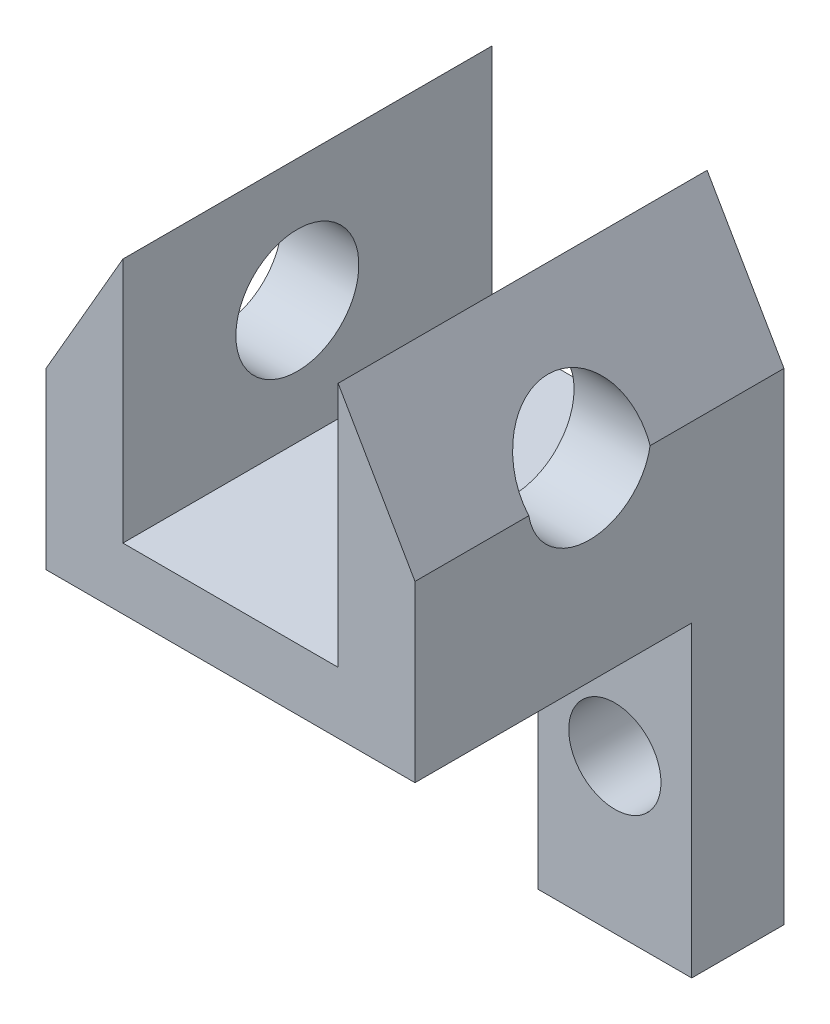
ISO-10303-21;
HEADER;
FILE_DESCRIPTION(('STEP AP214'),'2;1');
FILE_NAME('part.step','',(''),(''),'','','');
FILE_SCHEMA(('AUTOMOTIVE_DESIGN { 1 0 10303 214 1 1 1 1 }'));
ENDSEC;
DATA;
#1=APPLICATION_CONTEXT('core data for automotive mechanical design processes');
#2=APPLICATION_PROTOCOL_DEFINITION('international standard','automotive_design',2000,#1);
#3=PRODUCT_CONTEXT('',#1,'mechanical');
#4=PRODUCT('Part','Part','',(#3));
#5=PRODUCT_RELATED_PRODUCT_CATEGORY('part','',(#4));
#6=PRODUCT_DEFINITION_FORMATION('','',#4);
#7=PRODUCT_DEFINITION_CONTEXT('part definition',#1,'design');
#8=PRODUCT_DEFINITION('design','',#6,#7);
#9=PRODUCT_DEFINITION_SHAPE('','',#8);
#10=(LENGTH_UNIT() NAMED_UNIT(*) SI_UNIT(.MILLI.,.METRE.));
#11=(NAMED_UNIT(*) PLANE_ANGLE_UNIT() SI_UNIT($,.RADIAN.));
#12=(NAMED_UNIT(*) SI_UNIT($,.STERADIAN.) SOLID_ANGLE_UNIT());
#13=UNCERTAINTY_MEASURE_WITH_UNIT(LENGTH_MEASURE(1.E-05),#10,'distance_accuracy_value','');
#14=(GEOMETRIC_REPRESENTATION_CONTEXT(3) GLOBAL_UNCERTAINTY_ASSIGNED_CONTEXT((#13)) GLOBAL_UNIT_ASSIGNED_CONTEXT((#10,
#11,#12)) REPRESENTATION_CONTEXT('',''));
#15=CARTESIAN_POINT('',(0.,0.,0.));
#16=DIRECTION('',(0.,0.,1.));
#17=DIRECTION('',(1.,0.,0.));
#18=AXIS2_PLACEMENT_3D('',#15,#16,#17);
#19=CARTESIAN_POINT('',(-6.,2.,6.));
#20=DIRECTION('',(1.,0.,0.));
#21=DIRECTION('',(0.,0.,-1.));
#22=AXIS2_PLACEMENT_3D('',#19,#20,#21);
#23=PLANE('',#22);
#24=CARTESIAN_POINT('',(-6.,6.,0.326138493477825));
#25=DIRECTION('',(-1.,0.,0.));
#26=DIRECTION('',(0.,0.,1.));
#27=AXIS2_PLACEMENT_3D('',#24,#25,#26);
#28=CIRCLE('',#27,2.);
#29=CARTESIAN_POINT('',(-6.,5.66987298107782,-1.64642738663304));
#30=VERTEX_POINT('',#29);
#31=CARTESIAN_POINT('',(-6.,5.66987298107782,2.29870437358869));
#32=VERTEX_POINT('',#31);
#33=EDGE_CURVE('E162',#30,#32,#28,.T.);
#34=ORIENTED_EDGE('',*,*,#33,.F.);
#35=DIRECTION('',(0.,0.,1.));
#36=VECTOR('',#35,1.);
#37=CARTESIAN_POINT('',(-6.,5.66987298107782,-6.));
#38=LINE('',#37,#36);
#39=CARTESIAN_POINT('',(-6.,5.66987298107782,-6.));
#40=VERTEX_POINT('',#39);
#41=EDGE_CURVE('E187',#40,#30,#38,.T.);
#42=ORIENTED_EDGE('',*,*,#41,.F.);
#43=DIRECTION('',(0.,-1.,0.));
#44=VECTOR('',#43,1.);
#45=CARTESIAN_POINT('',(-6.,2.,-6.));
#46=LINE('',#45,#44);
#47=CARTESIAN_POINT('',(-6.,0.,-6.));
#48=VERTEX_POINT('',#47);
#49=EDGE_CURVE('E236',#40,#48,#46,.T.);
#50=ORIENTED_EDGE('',*,*,#49,.T.);
#51=DIRECTION('',(0.,0.,1.));
#52=VECTOR('',#51,1.);
#53=CARTESIAN_POINT('',(-6.,0.,6.));
#54=LINE('',#53,#52);
#55=CARTESIAN_POINT('',(-6.,0.,6.));
#56=VERTEX_POINT('',#55);
#57=EDGE_CURVE('E227',#48,#56,#54,.T.);
#58=ORIENTED_EDGE('',*,*,#57,.T.);
#59=DIRECTION('',(0.,-1.,0.));
#60=VECTOR('',#59,1.);
#61=CARTESIAN_POINT('',(-6.,2.,6.));
#62=LINE('',#61,#60);
#63=CARTESIAN_POINT('',(-6.,5.66987298107781,6.));
#64=VERTEX_POINT('',#63);
#65=EDGE_CURVE('E237',#64,#56,#62,.T.);
#66=ORIENTED_EDGE('',*,*,#65,.F.);
#67=EDGE_CURVE('E189',#32,#64,#38,.T.);
#68=ORIENTED_EDGE('',*,*,#67,.F.);
#69=EDGE_LOOP('',(#34,#42,#50,#58,#66,#68));
#70=FACE_BOUND('',#69,.T.);
#71=ADVANCED_FACE('F44',(#70),#23,.F.);
#72=CARTESIAN_POINT('',(-6.,2.,6.));
#73=DIRECTION('',(0.,0.,-1.));
#74=DIRECTION('',(-1.,0.,0.));
#75=AXIS2_PLACEMENT_3D('',#72,#73,#74);
#76=PLANE('',#75);
#77=DIRECTION('',(0.500000000000001,0.866025403784438,0.));
#78=VECTOR('',#77,1.);
#79=CARTESIAN_POINT('',(-3.5,10.,6.));
#80=LINE('',#79,#78);
#81=CARTESIAN_POINT('',(-3.5,10.,6.));
#82=VERTEX_POINT('',#81);
#83=EDGE_CURVE('E186',#64,#82,#80,.T.);
#84=ORIENTED_EDGE('',*,*,#83,.F.);
#85=ORIENTED_EDGE('',*,*,#65,.T.);
#86=DIRECTION('',(1.,0.,0.));
#87=VECTOR('',#86,1.);
#88=CARTESIAN_POINT('',(-6.,0.,6.));
#89=LINE('',#88,#87);
#90=CARTESIAN_POINT('',(6.,0.,6.));
#91=VERTEX_POINT('',#90);
#92=EDGE_CURVE('E223',#56,#91,#89,.T.);
#93=ORIENTED_EDGE('',*,*,#92,.T.);
#94=DIRECTION('',(0.,-1.,0.));
#95=VECTOR('',#94,1.);
#96=CARTESIAN_POINT('',(6.,2.,6.));
#97=LINE('',#96,#95);
#98=CARTESIAN_POINT('',(6.,5.66987298107782,6.));
#99=VERTEX_POINT('',#98);
#100=EDGE_CURVE('E226',#99,#91,#97,.T.);
#101=ORIENTED_EDGE('',*,*,#100,.F.);
#102=DIRECTION('',(0.500000000000001,-0.866025403784438,0.));
#103=VECTOR('',#102,1.);
#104=CARTESIAN_POINT('',(3.5,10.,6.));
#105=LINE('',#104,#103);
#106=CARTESIAN_POINT('',(3.5,10.,6.));
#107=VERTEX_POINT('',#106);
#108=EDGE_CURVE('E188',#107,#99,#105,.T.);
#109=ORIENTED_EDGE('',*,*,#108,.F.);
#110=DIRECTION('',(0.,-1.,0.));
#111=VECTOR('',#110,1.);
#112=CARTESIAN_POINT('',(3.5,10.,6.));
#113=LINE('',#112,#111);
#114=CARTESIAN_POINT('',(3.5,2.,6.));
#115=VERTEX_POINT('',#114);
#116=EDGE_CURVE('E214',#107,#115,#113,.T.);
#117=ORIENTED_EDGE('',*,*,#116,.T.);
#118=DIRECTION('',(1.,0.,0.));
#119=VECTOR('',#118,1.);
#120=CARTESIAN_POINT('',(-6.,2.,6.));
#121=LINE('',#120,#119);
#122=CARTESIAN_POINT('',(-3.5,2.,6.));
#123=VERTEX_POINT('',#122);
#124=EDGE_CURVE('E221',#123,#115,#121,.T.);
#125=ORIENTED_EDGE('',*,*,#124,.F.);
#126=DIRECTION('',(0.,-1.,0.));
#127=VECTOR('',#126,1.);
#128=CARTESIAN_POINT('',(-3.5,10.,6.));
#129=LINE('',#128,#127);
#130=EDGE_CURVE('E209',#82,#123,#129,.T.);
#131=ORIENTED_EDGE('',*,*,#130,.F.);
#132=EDGE_LOOP('',(#84,#85,#93,#101,#109,#117,#125,#131));
#133=FACE_BOUND('',#132,.T.);
#134=ADVANCED_FACE('F269',(#133),#76,.F.);
#135=CARTESIAN_POINT('',(0.,2.,0.));
#136=DIRECTION('',(0.,-1.,0.));
#137=DIRECTION('',(0.,0.,-1.));
#138=AXIS2_PLACEMENT_3D('',#135,#136,#137);
#139=PLANE('',#138);
#140=DIRECTION('',(0.,0.,-1.));
#141=VECTOR('',#140,1.);
#142=CARTESIAN_POINT('',(-3.5,2.,-6.));
#143=LINE('',#142,#141);
#144=CARTESIAN_POINT('',(-3.5,2.,-6.));
#145=VERTEX_POINT('',#144);
#146=EDGE_CURVE('E204',#123,#145,#143,.T.);
#147=ORIENTED_EDGE('',*,*,#146,.F.);
#148=ORIENTED_EDGE('',*,*,#124,.T.);
#149=DIRECTION('',(0.,0.,1.));
#150=VECTOR('',#149,1.);
#151=CARTESIAN_POINT('',(3.5,2.,6.));
#152=LINE('',#151,#150);
#153=CARTESIAN_POINT('',(3.5,2.,-6.));
#154=VERTEX_POINT('',#153);
#155=EDGE_CURVE('E210',#154,#115,#152,.T.);
#156=ORIENTED_EDGE('',*,*,#155,.F.);
#157=DIRECTION('',(-1.,0.,0.));
#158=VECTOR('',#157,1.);
#159=CARTESIAN_POINT('',(-6.,2.,-6.));
#160=LINE('',#159,#158);
#161=EDGE_CURVE('E225',#154,#145,#160,.T.);
#162=ORIENTED_EDGE('',*,*,#161,.T.);
#163=EDGE_LOOP('',(#147,#148,#156,#162));
#164=FACE_BOUND('',#163,.T.);
#165=ADVANCED_FACE('F292',(#164),#139,.F.);
#166=CARTESIAN_POINT('',(6.,2.,6.));
#167=DIRECTION('',(-1.,0.,0.));
#168=DIRECTION('',(0.,0.,1.));
#169=AXIS2_PLACEMENT_3D('',#166,#167,#168);
#170=PLANE('',#169);
#171=DIRECTION('',(0.,0.,1.));
#172=VECTOR('',#171,1.);
#173=CARTESIAN_POINT('',(6.,5.66987298107782,-6.));
#174=LINE('',#173,#172);
#175=CARTESIAN_POINT('',(6.,5.66987298107782,-6.));
#176=VERTEX_POINT('',#175);
#177=CARTESIAN_POINT('',(6.,5.66987298107782,-1.64642738663304));
#178=VERTEX_POINT('',#177);
#179=EDGE_CURVE('E193',#176,#178,#174,.T.);
#180=ORIENTED_EDGE('',*,*,#179,.T.);
#181=CARTESIAN_POINT('',(6.,6.,0.326138493477825));
#182=DIRECTION('',(-1.,0.,0.));
#183=DIRECTION('',(0.,0.,1.));
#184=AXIS2_PLACEMENT_3D('',#181,#182,#183);
#185=CIRCLE('',#184,2.);
#186=CARTESIAN_POINT('',(6.,5.66987298107782,2.29870437358869));
#187=VERTEX_POINT('',#186);
#188=EDGE_CURVE('E164',#178,#187,#185,.T.);
#189=ORIENTED_EDGE('',*,*,#188,.T.);
#190=EDGE_CURVE('E185',#187,#99,#174,.T.);
#191=ORIENTED_EDGE('',*,*,#190,.T.);
#192=ORIENTED_EDGE('',*,*,#100,.T.);
#193=DIRECTION('',(0.,0.,-1.));
#194=VECTOR('',#193,1.);
#195=CARTESIAN_POINT('',(6.,0.,6.));
#196=LINE('',#195,#194);
#197=CARTESIAN_POINT('',(6.,0.,-3.));
#198=VERTEX_POINT('',#197);
#199=EDGE_CURVE('E165',#91,#198,#196,.T.);
#200=ORIENTED_EDGE('',*,*,#199,.T.);
#201=DIRECTION('',(0.,1.,0.));
#202=VECTOR('',#201,1.);
#203=CARTESIAN_POINT('',(6.,-10.,-3.));
#204=LINE('',#203,#202);
#205=CARTESIAN_POINT('',(6.,-10.,-3.));
#206=VERTEX_POINT('',#205);
#207=EDGE_CURVE('E145',#206,#198,#204,.T.);
#208=ORIENTED_EDGE('',*,*,#207,.F.);
#209=DIRECTION('',(0.,0.,1.));
#210=VECTOR('',#209,1.);
#211=CARTESIAN_POINT('',(6.,-10.,-6.));
#212=LINE('',#211,#210);
#213=CARTESIAN_POINT('',(6.,-10.,-6.));
#214=VERTEX_POINT('',#213);
#215=EDGE_CURVE('E147',#214,#206,#212,.T.);
#216=ORIENTED_EDGE('',*,*,#215,.F.);
#217=DIRECTION('',(0.,-1.,0.));
#218=VECTOR('',#217,1.);
#219=CARTESIAN_POINT('',(6.,2.,-6.));
#220=LINE('',#219,#218);
#221=EDGE_CURVE('E52',#176,#214,#220,.T.);
#222=ORIENTED_EDGE('',*,*,#221,.F.);
#223=EDGE_LOOP('',(#180,#189,#191,#192,#200,#208,#216,#222));
#224=FACE_BOUND('',#223,.T.);
#225=ADVANCED_FACE('F50',(#224),#170,.F.);
#226=CARTESIAN_POINT('',(-6.,2.,-6.));
#227=DIRECTION('',(0.,0.,1.));
#228=DIRECTION('',(1.,0.,0.));
#229=AXIS2_PLACEMENT_3D('',#226,#227,#228);
#230=PLANE('',#229);
#231=CARTESIAN_POINT('',(3.5,-5.,-6.));
#232=DIRECTION('',(0.,0.,1.));
#233=DIRECTION('',(1.,0.,0.));
#234=AXIS2_PLACEMENT_3D('',#231,#232,#233);
#235=CIRCLE('',#234,1.49999999999999);
#236=CARTESIAN_POINT('',(4.99999999999999,-5.,-6.));
#237=VERTEX_POINT('',#236);
#238=EDGE_CURVE('E327',#237,#237,#235,.T.);
#239=ORIENTED_EDGE('',*,*,#238,.T.);
#240=EDGE_LOOP('',(#239));
#241=FACE_BOUND('',#240,.T.);
#242=ORIENTED_EDGE('',*,*,#49,.F.);
#243=DIRECTION('',(0.500000000000001,0.866025403784438,0.));
#244=VECTOR('',#243,1.);
#245=CARTESIAN_POINT('',(-3.5,10.,-6.));
#246=LINE('',#245,#244);
#247=CARTESIAN_POINT('',(-3.5,10.,-6.));
#248=VERTEX_POINT('',#247);
#249=EDGE_CURVE('E181',#40,#248,#246,.T.);
#250=ORIENTED_EDGE('',*,*,#249,.T.);
#251=DIRECTION('',(0.,-1.,0.));
#252=VECTOR('',#251,1.);
#253=CARTESIAN_POINT('',(-3.5,10.,-6.));
#254=LINE('',#253,#252);
#255=EDGE_CURVE('E201',#248,#145,#254,.T.);
#256=ORIENTED_EDGE('',*,*,#255,.T.);
#257=ORIENTED_EDGE('',*,*,#161,.F.);
#258=DIRECTION('',(0.,-1.,0.));
#259=VECTOR('',#258,1.);
#260=CARTESIAN_POINT('',(3.5,10.,-6.));
#261=LINE('',#260,#259);
#262=CARTESIAN_POINT('',(3.5,10.,-6.));
#263=VERTEX_POINT('',#262);
#264=EDGE_CURVE('E192',#263,#154,#261,.T.);
#265=ORIENTED_EDGE('',*,*,#264,.F.);
#266=DIRECTION('',(0.500000000000001,-0.866025403784438,0.));
#267=VECTOR('',#266,1.);
#268=CARTESIAN_POINT('',(3.5,10.,-6.));
#269=LINE('',#268,#267);
#270=EDGE_CURVE('E198',#263,#176,#269,.T.);
#271=ORIENTED_EDGE('',*,*,#270,.T.);
#272=ORIENTED_EDGE('',*,*,#221,.T.);
#273=DIRECTION('',(1.,0.,0.));
#274=VECTOR('',#273,1.);
#275=CARTESIAN_POINT('',(6.,-10.,-6.));
#276=LINE('',#275,#274);
#277=CARTESIAN_POINT('',(0.999999999999998,-10.,-6.));
#278=VERTEX_POINT('',#277);
#279=EDGE_CURVE('E156',#278,#214,#276,.T.);
#280=ORIENTED_EDGE('',*,*,#279,.F.);
#281=DIRECTION('',(0.,1.,0.));
#282=VECTOR('',#281,1.);
#283=CARTESIAN_POINT('',(0.999999999999998,-10.,-6.));
#284=LINE('',#283,#282);
#285=CARTESIAN_POINT('',(0.999999999999998,0.,-6.));
#286=VERTEX_POINT('',#285);
#287=EDGE_CURVE('E170',#278,#286,#284,.T.);
#288=ORIENTED_EDGE('',*,*,#287,.T.);
#289=DIRECTION('',(-1.,0.,0.));
#290=VECTOR('',#289,1.);
#291=CARTESIAN_POINT('',(-6.,0.,-6.));
#292=LINE('',#291,#290);
#293=EDGE_CURVE('E58',#286,#48,#292,.T.);
#294=ORIENTED_EDGE('',*,*,#293,.T.);
#295=EDGE_LOOP('',(#242,#250,#256,#257,#265,#271,#272,#280,#288,#294));
#296=FACE_BOUND('',#295,.T.);
#297=ADVANCED_FACE('F241',(#241,#296),#230,.F.);
#298=CARTESIAN_POINT('',(0.,0.,0.));
#299=DIRECTION('',(0.,-1.,0.));
#300=DIRECTION('',(0.,0.,-1.));
#301=AXIS2_PLACEMENT_3D('',#298,#299,#300);
#302=PLANE('',#301);
#303=DIRECTION('',(0.,0.,-1.));
#304=VECTOR('',#303,1.);
#305=CARTESIAN_POINT('',(0.999999999999998,0.,-6.));
#306=LINE('',#305,#304);
#307=CARTESIAN_POINT('',(0.999999999999998,0.,-3.));
#308=VERTEX_POINT('',#307);
#309=EDGE_CURVE('E157',#308,#286,#306,.T.);
#310=ORIENTED_EDGE('',*,*,#309,.F.);
#311=DIRECTION('',(-1.,0.,0.));
#312=VECTOR('',#311,1.);
#313=CARTESIAN_POINT('',(6.,0.,-3.));
#314=LINE('',#313,#312);
#315=EDGE_CURVE('E66',#198,#308,#314,.T.);
#316=ORIENTED_EDGE('',*,*,#315,.F.);
#317=ORIENTED_EDGE('',*,*,#199,.F.);
#318=ORIENTED_EDGE('',*,*,#92,.F.);
#319=ORIENTED_EDGE('',*,*,#57,.F.);
#320=ORIENTED_EDGE('',*,*,#293,.F.);
#321=EDGE_LOOP('',(#310,#316,#317,#318,#319,#320));
#322=FACE_BOUND('',#321,.T.);
#323=ADVANCED_FACE('F257',(#322),#302,.T.);
#324=CARTESIAN_POINT('',(3.5,10.,6.));
#325=DIRECTION('',(1.,0.,0.));
#326=DIRECTION('',(0.,0.,-1.));
#327=AXIS2_PLACEMENT_3D('',#324,#325,#326);
#328=PLANE('',#327);
#329=CARTESIAN_POINT('',(3.5,6.,0.326138493477825));
#330=DIRECTION('',(1.,0.,0.));
#331=DIRECTION('',(0.,0.,-1.));
#332=AXIS2_PLACEMENT_3D('',#329,#330,#331);
#333=CIRCLE('',#332,2.);
#334=CARTESIAN_POINT('',(3.5,6.,-1.67386150652218));
#335=VERTEX_POINT('',#334);
#336=EDGE_CURVE('E178',#335,#335,#333,.T.);
#337=ORIENTED_EDGE('',*,*,#336,.T.);
#338=EDGE_LOOP('',(#337));
#339=FACE_BOUND('',#338,.T.);
#340=ORIENTED_EDGE('',*,*,#155,.T.);
#341=ORIENTED_EDGE('',*,*,#116,.F.);
#342=DIRECTION('',(0.,0.,1.));
#343=VECTOR('',#342,1.);
#344=CARTESIAN_POINT('',(3.5,10.,6.));
#345=LINE('',#344,#343);
#346=EDGE_CURVE('E217',#263,#107,#345,.T.);
#347=ORIENTED_EDGE('',*,*,#346,.F.);
#348=ORIENTED_EDGE('',*,*,#264,.T.);
#349=EDGE_LOOP('',(#340,#341,#347,#348));
#350=FACE_BOUND('',#349,.T.);
#351=ADVANCED_FACE('F258',(#339,#350),#328,.F.);
#352=CARTESIAN_POINT('',(-3.5,10.,-6.));
#353=DIRECTION('',(-1.,0.,0.));
#354=DIRECTION('',(0.,0.,1.));
#355=AXIS2_PLACEMENT_3D('',#352,#353,#354);
#356=PLANE('',#355);
#357=CARTESIAN_POINT('',(-3.5,6.,0.326138493477825));
#358=DIRECTION('',(-1.,0.,0.));
#359=DIRECTION('',(0.,0.,1.));
#360=AXIS2_PLACEMENT_3D('',#357,#358,#359);
#361=CIRCLE('',#360,2.);
#362=CARTESIAN_POINT('',(-3.5,6.,2.32613849347783));
#363=VERTEX_POINT('',#362);
#364=EDGE_CURVE('E176',#363,#363,#361,.T.);
#365=ORIENTED_EDGE('',*,*,#364,.T.);
#366=EDGE_LOOP('',(#365));
#367=FACE_BOUND('',#366,.T.);
#368=ORIENTED_EDGE('',*,*,#146,.T.);
#369=ORIENTED_EDGE('',*,*,#255,.F.);
#370=DIRECTION('',(0.,0.,-1.));
#371=VECTOR('',#370,1.);
#372=CARTESIAN_POINT('',(-3.5,10.,-6.));
#373=LINE('',#372,#371);
#374=EDGE_CURVE('E203',#82,#248,#373,.T.);
#375=ORIENTED_EDGE('',*,*,#374,.F.);
#376=ORIENTED_EDGE('',*,*,#130,.T.);
#377=EDGE_LOOP('',(#368,#369,#375,#376));
#378=FACE_BOUND('',#377,.T.);
#379=ADVANCED_FACE('F259',(#367,#378),#356,.F.);
#380=CARTESIAN_POINT('',(3.5,10.,-6.));
#381=DIRECTION('',(-0.866025403784438,-0.500000000000001,0.));
#382=DIRECTION('',(0.500000000000001,-0.866025403784438,0.));
#383=AXIS2_PLACEMENT_3D('',#380,#381,#382);
#384=PLANE('',#383);
#385=ORIENTED_EDGE('',*,*,#190,.F.);
#386=CARTESIAN_POINT('',(5.80940107675851,6.,0.326138493477825));
#387=DIRECTION('',(-0.866025403784438,-0.500000000000001,0.));
#388=DIRECTION('',(-0.500000000000001,0.866025403784438,0.));
#389=AXIS2_PLACEMENT_3D('',#386,#387,#388);
#390=ELLIPSE('',#389,2.30940107675851,2.);
#391=EDGE_CURVE('E175',#187,#178,#390,.T.);
#392=ORIENTED_EDGE('',*,*,#391,.T.);
#393=ORIENTED_EDGE('',*,*,#179,.F.);
#394=ORIENTED_EDGE('',*,*,#270,.F.);
#395=ORIENTED_EDGE('',*,*,#346,.T.);
#396=ORIENTED_EDGE('',*,*,#108,.T.);
#397=EDGE_LOOP('',(#385,#392,#393,#394,#395,#396));
#398=FACE_BOUND('',#397,.T.);
#399=ADVANCED_FACE('F250',(#398),#384,.F.);
#400=CARTESIAN_POINT('',(-3.5,10.,-6.));
#401=DIRECTION('',(0.866025403784438,-0.500000000000001,0.));
#402=DIRECTION('',(0.500000000000001,0.866025403784438,0.));
#403=AXIS2_PLACEMENT_3D('',#400,#401,#402);
#404=PLANE('',#403);
#405=ORIENTED_EDGE('',*,*,#41,.T.);
#406=CARTESIAN_POINT('',(-5.80940107675851,6.,0.326138493477825));
#407=DIRECTION('',(0.866025403784438,-0.500000000000001,0.));
#408=DIRECTION('',(-0.500000000000001,-0.866025403784438,0.));
#409=AXIS2_PLACEMENT_3D('',#406,#407,#408);
#410=ELLIPSE('',#409,2.30940107675851,2.);
#411=EDGE_CURVE('E11',#30,#32,#410,.T.);
#412=ORIENTED_EDGE('',*,*,#411,.T.);
#413=ORIENTED_EDGE('',*,*,#67,.T.);
#414=ORIENTED_EDGE('',*,*,#83,.T.);
#415=ORIENTED_EDGE('',*,*,#374,.T.);
#416=ORIENTED_EDGE('',*,*,#249,.F.);
#417=EDGE_LOOP('',(#405,#412,#413,#414,#415,#416));
#418=FACE_BOUND('',#417,.T.);
#419=ADVANCED_FACE('F296',(#418),#404,.F.);
#420=CARTESIAN_POINT('',(6.,6.,0.326138493477825));
#421=DIRECTION('',(-1.,0.,0.));
#422=DIRECTION('',(0.,0.,1.));
#423=AXIS2_PLACEMENT_3D('',#420,#421,#422);
#424=CYLINDRICAL_SURFACE('',#423,2.);
#425=ORIENTED_EDGE('',*,*,#33,.T.);
#426=ORIENTED_EDGE('',*,*,#411,.F.);
#427=EDGE_LOOP('',(#425,#426));
#428=FACE_BOUND('',#427,.T.);
#429=ORIENTED_EDGE('',*,*,#364,.F.);
#430=EDGE_LOOP('',(#429));
#431=FACE_BOUND('',#430,.T.);
#432=ADVANCED_FACE('F252',(#428,#431),#424,.F.);
#433=ORIENTED_EDGE('',*,*,#188,.F.);
#434=ORIENTED_EDGE('',*,*,#391,.F.);
#435=EDGE_LOOP('',(#433,#434));
#436=FACE_BOUND('',#435,.T.);
#437=ORIENTED_EDGE('',*,*,#336,.F.);
#438=EDGE_LOOP('',(#437));
#439=FACE_BOUND('',#438,.T.);
#440=ADVANCED_FACE('F248',(#436,#439),#424,.F.);
#441=CARTESIAN_POINT('',(6.,-10.,-3.));
#442=DIRECTION('',(0.,0.,-1.));
#443=DIRECTION('',(-1.,0.,0.));
#444=AXIS2_PLACEMENT_3D('',#441,#442,#443);
#445=PLANE('',#444);
#446=CARTESIAN_POINT('',(3.5,-5.,-3.));
#447=DIRECTION('',(0.,0.,1.));
#448=DIRECTION('',(1.,0.,0.));
#449=AXIS2_PLACEMENT_3D('',#446,#447,#448);
#450=CIRCLE('',#449,1.49999999999999);
#451=CARTESIAN_POINT('',(4.99999999999999,-5.,-3.));
#452=VERTEX_POINT('',#451);
#453=EDGE_CURVE('E332',#452,#452,#450,.T.);
#454=ORIENTED_EDGE('',*,*,#453,.F.);
#455=EDGE_LOOP('',(#454));
#456=FACE_BOUND('',#455,.T.);
#457=ORIENTED_EDGE('',*,*,#315,.T.);
#458=DIRECTION('',(0.,1.,0.));
#459=VECTOR('',#458,1.);
#460=CARTESIAN_POINT('',(0.999999999999998,-10.,-3.));
#461=LINE('',#460,#459);
#462=CARTESIAN_POINT('',(0.999999999999998,-10.,-3.));
#463=VERTEX_POINT('',#462);
#464=EDGE_CURVE('E148',#463,#308,#461,.T.);
#465=ORIENTED_EDGE('',*,*,#464,.F.);
#466=DIRECTION('',(-1.,0.,0.));
#467=VECTOR('',#466,1.);
#468=CARTESIAN_POINT('',(6.,-10.,-3.));
#469=LINE('',#468,#467);
#470=EDGE_CURVE('E139',#206,#463,#469,.T.);
#471=ORIENTED_EDGE('',*,*,#470,.F.);
#472=ORIENTED_EDGE('',*,*,#207,.T.);
#473=EDGE_LOOP('',(#457,#465,#471,#472));
#474=FACE_BOUND('',#473,.T.);
#475=ADVANCED_FACE('F142',(#456,#474),#445,.F.);
#476=CARTESIAN_POINT('',(0.999999999999998,-10.,-6.));
#477=DIRECTION('',(1.,0.,0.));
#478=DIRECTION('',(0.,0.,-1.));
#479=AXIS2_PLACEMENT_3D('',#476,#477,#478);
#480=PLANE('',#479);
#481=ORIENTED_EDGE('',*,*,#309,.T.);
#482=ORIENTED_EDGE('',*,*,#287,.F.);
#483=DIRECTION('',(0.,0.,-1.));
#484=VECTOR('',#483,1.);
#485=CARTESIAN_POINT('',(0.999999999999998,-10.,-6.));
#486=LINE('',#485,#484);
#487=EDGE_CURVE('E149',#463,#278,#486,.T.);
#488=ORIENTED_EDGE('',*,*,#487,.F.);
#489=ORIENTED_EDGE('',*,*,#464,.T.);
#490=EDGE_LOOP('',(#481,#482,#488,#489));
#491=FACE_BOUND('',#490,.T.);
#492=ADVANCED_FACE('F314',(#491),#480,.F.);
#493=CARTESIAN_POINT('',(0.,-10.,0.));
#494=DIRECTION('',(0.,-1.,0.));
#495=DIRECTION('',(0.,0.,-1.));
#496=AXIS2_PLACEMENT_3D('',#493,#494,#495);
#497=PLANE('',#496);
#498=ORIENTED_EDGE('',*,*,#215,.T.);
#499=ORIENTED_EDGE('',*,*,#470,.T.);
#500=ORIENTED_EDGE('',*,*,#487,.T.);
#501=ORIENTED_EDGE('',*,*,#279,.T.);
#502=EDGE_LOOP('',(#498,#499,#500,#501));
#503=FACE_BOUND('',#502,.T.);
#504=ADVANCED_FACE('F152',(#503),#497,.T.);
#505=CARTESIAN_POINT('',(3.5,-5.,-3.));
#506=DIRECTION('',(0.,0.,1.));
#507=DIRECTION('',(1.,0.,0.));
#508=AXIS2_PLACEMENT_3D('',#505,#506,#507);
#509=CYLINDRICAL_SURFACE('',#508,1.49999999999999);
#510=ORIENTED_EDGE('',*,*,#238,.F.);
#511=EDGE_LOOP('',(#510));
#512=FACE_BOUND('',#511,.T.);
#513=ORIENTED_EDGE('',*,*,#453,.T.);
#514=EDGE_LOOP('',(#513));
#515=FACE_BOUND('',#514,.T.);
#516=ADVANCED_FACE('F319',(#512,#515),#509,.F.);
#517=CLOSED_SHELL('',(#71,#134,#165,#225,#297,#323,#351,#379,#399,#419,#432,#440,#475,#492,#504,#516));
#518=MANIFOLD_SOLID_BREP('B2',#517);
#519=ADVANCED_BREP_SHAPE_REPRESENTATION('',(#18,#518),#14);
#520=SHAPE_DEFINITION_REPRESENTATION(#9,#519);
ENDSEC;
END-ISO-10303-21;
